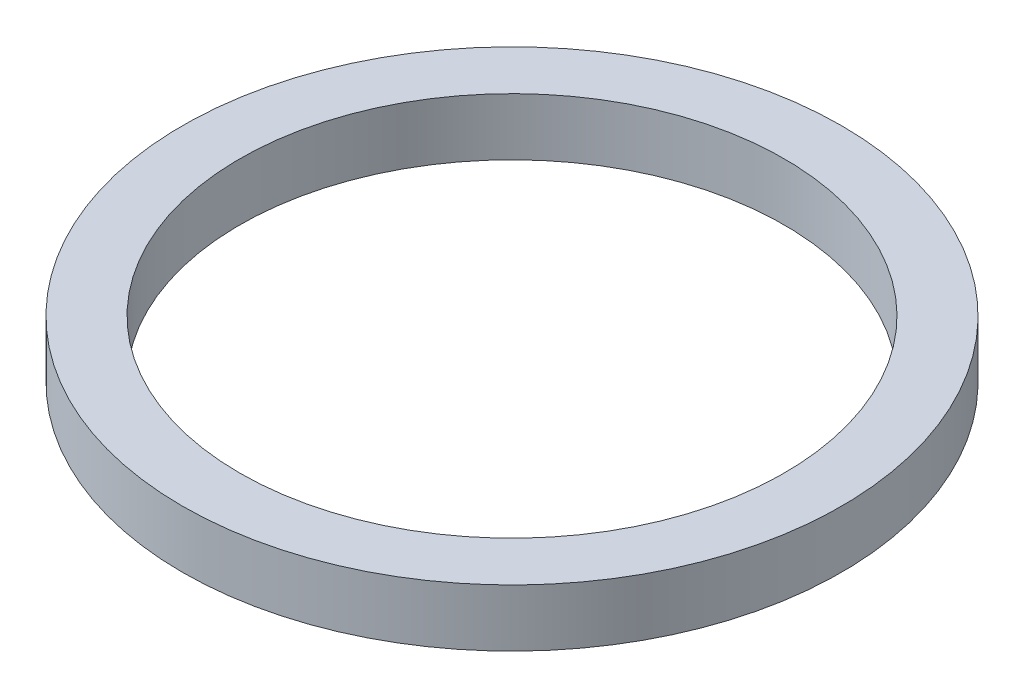
ISO-10303-21;
HEADER;
FILE_DESCRIPTION(('STEP AP214'),'2;1');
FILE_NAME('part.step','',(''),(''),'','','');
FILE_SCHEMA(('AUTOMOTIVE_DESIGN { 1 0 10303 214 1 1 1 1 }'));
ENDSEC;
DATA;
#1=APPLICATION_CONTEXT('core data for automotive mechanical design processes');
#2=APPLICATION_PROTOCOL_DEFINITION('international standard','automotive_design',2000,#1);
#3=PRODUCT_CONTEXT('',#1,'mechanical');
#4=PRODUCT('Part','Part','',(#3));
#5=PRODUCT_RELATED_PRODUCT_CATEGORY('part','',(#4));
#6=PRODUCT_DEFINITION_FORMATION('','',#4);
#7=PRODUCT_DEFINITION_CONTEXT('part definition',#1,'design');
#8=PRODUCT_DEFINITION('design','',#6,#7);
#9=PRODUCT_DEFINITION_SHAPE('','',#8);
#10=(LENGTH_UNIT() NAMED_UNIT(*) SI_UNIT(.MILLI.,.METRE.));
#11=(NAMED_UNIT(*) PLANE_ANGLE_UNIT() SI_UNIT($,.RADIAN.));
#12=(NAMED_UNIT(*) SI_UNIT($,.STERADIAN.) SOLID_ANGLE_UNIT());
#13=UNCERTAINTY_MEASURE_WITH_UNIT(LENGTH_MEASURE(1.E-05),#10,'distance_accuracy_value','');
#14=(GEOMETRIC_REPRESENTATION_CONTEXT(3) GLOBAL_UNCERTAINTY_ASSIGNED_CONTEXT((#13)) GLOBAL_UNIT_ASSIGNED_CONTEXT((#10,
#11,#12)) REPRESENTATION_CONTEXT('',''));
#15=CARTESIAN_POINT('',(0.,0.,0.));
#16=DIRECTION('',(0.,0.,1.));
#17=DIRECTION('',(1.,0.,0.));
#18=AXIS2_PLACEMENT_3D('',#15,#16,#17);
#19=CARTESIAN_POINT('',(0.,1.,0.));
#20=DIRECTION('',(0.,1.,0.));
#21=DIRECTION('',(0.,0.,1.));
#22=AXIS2_PLACEMENT_3D('',#19,#20,#21);
#23=PLANE('',#22);
#24=CARTESIAN_POINT('',(0.,1.,0.));
#25=DIRECTION('',(0.,1.,0.));
#26=DIRECTION('',(0.,0.,1.));
#27=AXIS2_PLACEMENT_3D('',#24,#25,#26);
#28=CIRCLE('',#27,5.75);
#29=CARTESIAN_POINT('',(0.,1.,5.75));
#30=VERTEX_POINT('',#29);
#31=EDGE_CURVE('E10',#30,#30,#28,.T.);
#32=ORIENTED_EDGE('',*,*,#31,.T.);
#33=EDGE_LOOP('',(#32));
#34=FACE_BOUND('',#33,.T.);
#35=CARTESIAN_POINT('',(0.,1.,0.));
#36=DIRECTION('',(0.,1.,0.));
#37=DIRECTION('',(0.,0.,1.));
#38=AXIS2_PLACEMENT_3D('',#35,#36,#37);
#39=CIRCLE('',#38,4.75);
#40=CARTESIAN_POINT('',(0.,1.,4.75));
#41=VERTEX_POINT('',#40);
#42=EDGE_CURVE('E43',#41,#41,#39,.T.);
#43=ORIENTED_EDGE('',*,*,#42,.F.);
#44=EDGE_LOOP('',(#43));
#45=FACE_BOUND('',#44,.T.);
#46=ADVANCED_FACE('F32',(#34,#45),#23,.T.);
#47=CARTESIAN_POINT('',(0.,0.,0.));
#48=DIRECTION('',(0.,1.,0.));
#49=DIRECTION('',(0.,0.,1.));
#50=AXIS2_PLACEMENT_3D('',#47,#48,#49);
#51=PLANE('',#50);
#52=CARTESIAN_POINT('',(0.,0.,0.));
#53=DIRECTION('',(0.,1.,0.));
#54=DIRECTION('',(0.,0.,1.));
#55=AXIS2_PLACEMENT_3D('',#52,#53,#54);
#56=CIRCLE('',#55,5.75);
#57=CARTESIAN_POINT('',(0.,0.,5.75));
#58=VERTEX_POINT('',#57);
#59=EDGE_CURVE('E36',#58,#58,#56,.T.);
#60=ORIENTED_EDGE('',*,*,#59,.F.);
#61=EDGE_LOOP('',(#60));
#62=FACE_BOUND('',#61,.T.);
#63=CARTESIAN_POINT('',(0.,0.,0.));
#64=DIRECTION('',(0.,1.,0.));
#65=DIRECTION('',(0.,0.,1.));
#66=AXIS2_PLACEMENT_3D('',#63,#64,#65);
#67=CIRCLE('',#66,4.75);
#68=CARTESIAN_POINT('',(0.,0.,4.75));
#69=VERTEX_POINT('',#68);
#70=EDGE_CURVE('E45',#69,#69,#67,.T.);
#71=ORIENTED_EDGE('',*,*,#70,.T.);
#72=EDGE_LOOP('',(#71));
#73=FACE_BOUND('',#72,.T.);
#74=ADVANCED_FACE('F55',(#62,#73),#51,.F.);
#75=CARTESIAN_POINT('',(0.,1.,0.));
#76=DIRECTION('',(0.,-1.,0.));
#77=DIRECTION('',(0.,0.,-1.));
#78=AXIS2_PLACEMENT_3D('',#75,#76,#77);
#79=CYLINDRICAL_SURFACE('',#78,5.75);
#80=ORIENTED_EDGE('',*,*,#31,.F.);
#81=EDGE_LOOP('',(#80));
#82=FACE_BOUND('',#81,.T.);
#83=ORIENTED_EDGE('',*,*,#59,.T.);
#84=EDGE_LOOP('',(#83));
#85=FACE_BOUND('',#84,.T.);
#86=ADVANCED_FACE('F34',(#82,#85),#79,.T.);
#87=CARTESIAN_POINT('',(0.,1.,0.));
#88=DIRECTION('',(0.,-1.,0.));
#89=DIRECTION('',(0.,0.,-1.));
#90=AXIS2_PLACEMENT_3D('',#87,#88,#89);
#91=CYLINDRICAL_SURFACE('',#90,4.75);
#92=ORIENTED_EDGE('',*,*,#42,.T.);
#93=EDGE_LOOP('',(#92));
#94=FACE_BOUND('',#93,.T.);
#95=ORIENTED_EDGE('',*,*,#70,.F.);
#96=EDGE_LOOP('',(#95));
#97=FACE_BOUND('',#96,.T.);
#98=ADVANCED_FACE('F51',(#94,#97),#91,.F.);
#99=CLOSED_SHELL('',(#46,#74,#86,#98));
#100=MANIFOLD_SOLID_BREP('B2',#99);
#101=ADVANCED_BREP_SHAPE_REPRESENTATION('',(#18,#100),#14);
#102=SHAPE_DEFINITION_REPRESENTATION(#9,#101);
ENDSEC;
END-ISO-10303-21;
